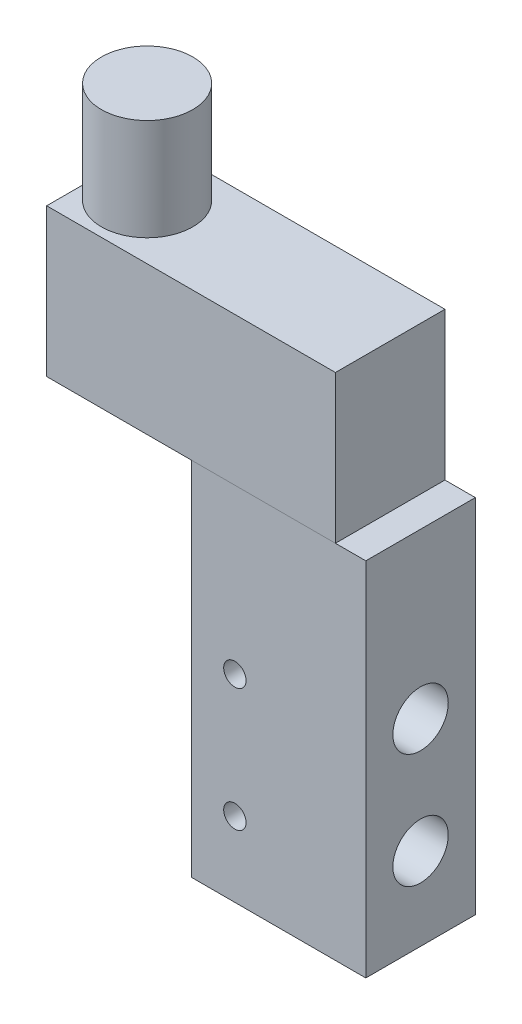
ISO-10303-21;
HEADER;
FILE_DESCRIPTION(('STEP AP214'),'2;1');
FILE_NAME('part.step','',(''),(''),'','','');
FILE_SCHEMA(('AUTOMOTIVE_DESIGN { 1 0 10303 214 1 1 1 1 }'));
ENDSEC;
DATA;
#1=APPLICATION_CONTEXT('core data for automotive mechanical design processes');
#2=APPLICATION_PROTOCOL_DEFINITION('international standard','automotive_design',2000,#1);
#3=PRODUCT_CONTEXT('',#1,'mechanical');
#4=PRODUCT('Part','Part','',(#3));
#5=PRODUCT_RELATED_PRODUCT_CATEGORY('part','',(#4));
#6=PRODUCT_DEFINITION_FORMATION('','',#4);
#7=PRODUCT_DEFINITION_CONTEXT('part definition',#1,'design');
#8=PRODUCT_DEFINITION('design','',#6,#7);
#9=PRODUCT_DEFINITION_SHAPE('','',#8);
#10=(LENGTH_UNIT() NAMED_UNIT(*) SI_UNIT(.MILLI.,.METRE.));
#11=(NAMED_UNIT(*) PLANE_ANGLE_UNIT() SI_UNIT($,.RADIAN.));
#12=(NAMED_UNIT(*) SI_UNIT($,.STERADIAN.) SOLID_ANGLE_UNIT());
#13=UNCERTAINTY_MEASURE_WITH_UNIT(LENGTH_MEASURE(1.E-05),#10,'distance_accuracy_value','');
#14=(GEOMETRIC_REPRESENTATION_CONTEXT(3) GLOBAL_UNCERTAINTY_ASSIGNED_CONTEXT((#13)) GLOBAL_UNIT_ASSIGNED_CONTEXT((#10,
#11,#12)) REPRESENTATION_CONTEXT('',''));
#15=CARTESIAN_POINT('',(0.,0.,0.));
#16=DIRECTION('',(0.,0.,1.));
#17=DIRECTION('',(1.,0.,0.));
#18=AXIS2_PLACEMENT_3D('',#15,#16,#17);
#19=CARTESIAN_POINT('',(0.,0.,0.));
#20=DIRECTION('',(0.,0.,1.));
#21=DIRECTION('',(1.,0.,0.));
#22=AXIS2_PLACEMENT_3D('',#19,#20,#21);
#23=PLANE('',#22);
#24=CARTESIAN_POINT('',(-8.8,-21.285,0.));
#25=DIRECTION('',(0.,0.,1.));
#26=DIRECTION('',(1.,0.,0.));
#27=AXIS2_PLACEMENT_3D('',#24,#25,#26);
#28=CIRCLE('',#27,2.24999999999999);
#29=CARTESIAN_POINT('',(-6.55,-21.285,0.));
#30=VERTEX_POINT('',#29);
#31=EDGE_CURVE('E153',#30,#30,#28,.T.);
#32=ORIENTED_EDGE('',*,*,#31,.T.);
#33=EDGE_LOOP('',(#32));
#34=FACE_BOUND('',#33,.T.);
#35=CARTESIAN_POINT('',(-8.8,3.41499999999999,0.));
#36=DIRECTION('',(0.,0.,1.));
#37=DIRECTION('',(1.,0.,0.));
#38=AXIS2_PLACEMENT_3D('',#35,#36,#37);
#39=CIRCLE('',#38,2.24999999999999);
#40=CARTESIAN_POINT('',(-6.55000000000001,3.41499999999999,0.));
#41=VERTEX_POINT('',#40);
#42=EDGE_CURVE('E147',#41,#41,#39,.T.);
#43=ORIENTED_EDGE('',*,*,#42,.T.);
#44=EDGE_LOOP('',(#43));
#45=FACE_BOUND('',#44,.T.);
#46=DIRECTION('',(-1.,0.,0.));
#47=VECTOR('',#46,1.);
#48=CARTESIAN_POINT('',(0.,36.285,0.));
#49=LINE('',#48,#47);
#50=CARTESIAN_POINT('',(11.4,36.285,0.));
#51=VERTEX_POINT('',#50);
#52=CARTESIAN_POINT('',(-17.5,36.285,0.));
#53=VERTEX_POINT('',#52);
#54=EDGE_CURVE('E11',#51,#53,#49,.T.);
#55=ORIENTED_EDGE('',*,*,#54,.F.);
#56=DIRECTION('',(-1.,0.,0.));
#57=VECTOR('',#56,1.);
#58=CARTESIAN_POINT('',(-17.5,36.285,0.));
#59=LINE('',#58,#57);
#60=CARTESIAN_POINT('',(17.5,36.285,0.));
#61=VERTEX_POINT('',#60);
#62=EDGE_CURVE('E206',#61,#51,#59,.T.);
#63=ORIENTED_EDGE('',*,*,#62,.F.);
#64=DIRECTION('',(0.,1.,0.));
#65=VECTOR('',#64,1.);
#66=CARTESIAN_POINT('',(17.5,36.285,0.));
#67=LINE('',#66,#65);
#68=CARTESIAN_POINT('',(17.5,-36.285,0.));
#69=VERTEX_POINT('',#68);
#70=EDGE_CURVE('E192',#69,#61,#67,.T.);
#71=ORIENTED_EDGE('',*,*,#70,.F.);
#72=DIRECTION('',(1.,0.,0.));
#73=VECTOR('',#72,1.);
#74=CARTESIAN_POINT('',(-17.5,-36.285,0.));
#75=LINE('',#74,#73);
#76=CARTESIAN_POINT('',(-17.5,-36.285,0.));
#77=VERTEX_POINT('',#76);
#78=EDGE_CURVE('E196',#77,#69,#75,.T.);
#79=ORIENTED_EDGE('',*,*,#78,.F.);
#80=DIRECTION('',(0.,-1.,0.));
#81=VECTOR('',#80,1.);
#82=CARTESIAN_POINT('',(-17.5,36.285,0.));
#83=LINE('',#82,#81);
#84=EDGE_CURVE('E209',#53,#77,#83,.T.);
#85=ORIENTED_EDGE('',*,*,#84,.F.);
#86=EDGE_LOOP('',(#55,#63,#71,#79,#85));
#87=FACE_BOUND('',#86,.T.);
#88=ADVANCED_FACE('F39',(#34,#45,#87),#23,.F.);
#89=CARTESIAN_POINT('',(0.,0.,22.));
#90=DIRECTION('',(0.,0.,1.));
#91=DIRECTION('',(1.,0.,0.));
#92=AXIS2_PLACEMENT_3D('',#89,#90,#91);
#93=PLANE('',#92);
#94=CARTESIAN_POINT('',(-8.8,3.41499999999999,22.));
#95=DIRECTION('',(0.,0.,1.));
#96=DIRECTION('',(1.,0.,0.));
#97=AXIS2_PLACEMENT_3D('',#94,#95,#96);
#98=CIRCLE('',#97,2.25);
#99=CARTESIAN_POINT('',(-6.55000000000001,3.41499999999999,22.));
#100=VERTEX_POINT('',#99);
#101=EDGE_CURVE('E144',#100,#100,#98,.T.);
#102=ORIENTED_EDGE('',*,*,#101,.F.);
#103=EDGE_LOOP('',(#102));
#104=FACE_BOUND('',#103,.T.);
#105=CARTESIAN_POINT('',(-8.8,-21.285,22.));
#106=DIRECTION('',(0.,0.,1.));
#107=DIRECTION('',(1.,0.,0.));
#108=AXIS2_PLACEMENT_3D('',#105,#106,#107);
#109=CIRCLE('',#108,2.25);
#110=CARTESIAN_POINT('',(-6.55,-21.285,22.));
#111=VERTEX_POINT('',#110);
#112=EDGE_CURVE('E150',#111,#111,#109,.T.);
#113=ORIENTED_EDGE('',*,*,#112,.F.);
#114=EDGE_LOOP('',(#113));
#115=FACE_BOUND('',#114,.T.);
#116=DIRECTION('',(-1.,0.,0.));
#117=VECTOR('',#116,1.);
#118=CARTESIAN_POINT('',(-17.5,36.285,22.));
#119=LINE('',#118,#117);
#120=CARTESIAN_POINT('',(11.8935960361455,36.285,22.));
#121=VERTEX_POINT('',#120);
#122=CARTESIAN_POINT('',(11.4,36.285,22.));
#123=VERTEX_POINT('',#122);
#124=EDGE_CURVE('E55',#121,#123,#119,.T.);
#125=ORIENTED_EDGE('',*,*,#124,.T.);
#126=DIRECTION('',(-1.,0.,0.));
#127=VECTOR('',#126,1.);
#128=CARTESIAN_POINT('',(0.,36.285,22.));
#129=LINE('',#128,#127);
#130=CARTESIAN_POINT('',(-17.5,36.285,22.));
#131=VERTEX_POINT('',#130);
#132=EDGE_CURVE('E48',#123,#131,#129,.T.);
#133=ORIENTED_EDGE('',*,*,#132,.T.);
#134=DIRECTION('',(0.,-1.,0.));
#135=VECTOR('',#134,1.);
#136=CARTESIAN_POINT('',(-17.5,36.285,22.));
#137=LINE('',#136,#135);
#138=CARTESIAN_POINT('',(-17.5,-36.285,22.));
#139=VERTEX_POINT('',#138);
#140=EDGE_CURVE('E199',#131,#139,#137,.T.);
#141=ORIENTED_EDGE('',*,*,#140,.T.);
#142=DIRECTION('',(1.,0.,0.));
#143=VECTOR('',#142,1.);
#144=CARTESIAN_POINT('',(-17.5,-36.285,22.));
#145=LINE('',#144,#143);
#146=CARTESIAN_POINT('',(17.5,-36.285,22.));
#147=VERTEX_POINT('',#146);
#148=EDGE_CURVE('E201',#139,#147,#145,.T.);
#149=ORIENTED_EDGE('',*,*,#148,.T.);
#150=DIRECTION('',(0.,1.,0.));
#151=VECTOR('',#150,1.);
#152=CARTESIAN_POINT('',(17.5,36.285,22.));
#153=LINE('',#152,#151);
#154=CARTESIAN_POINT('',(17.5,36.285,22.));
#155=VERTEX_POINT('',#154);
#156=EDGE_CURVE('E193',#147,#155,#153,.T.);
#157=ORIENTED_EDGE('',*,*,#156,.T.);
#158=EDGE_CURVE('E197',#155,#121,#119,.T.);
#159=ORIENTED_EDGE('',*,*,#158,.T.);
#160=EDGE_LOOP('',(#125,#133,#141,#149,#157,#159));
#161=FACE_BOUND('',#160,.T.);
#162=ADVANCED_FACE('F228',(#104,#115,#161),#93,.T.);
#163=CARTESIAN_POINT('',(-17.5,36.285,22.));
#164=DIRECTION('',(0.,-1.,0.));
#165=DIRECTION('',(0.,0.,-1.));
#166=AXIS2_PLACEMENT_3D('',#163,#164,#165);
#167=PLANE('',#166);
#168=DIRECTION('',(0.,0.,-1.));
#169=VECTOR('',#168,1.);
#170=CARTESIAN_POINT('',(11.4,36.285,0.));
#171=LINE('',#170,#169);
#172=EDGE_CURVE('E172',#123,#51,#171,.T.);
#173=ORIENTED_EDGE('',*,*,#172,.F.);
#174=ORIENTED_EDGE('',*,*,#124,.F.);
#175=ORIENTED_EDGE('',*,*,#158,.F.);
#176=DIRECTION('',(0.,0.,-1.));
#177=VECTOR('',#176,1.);
#178=CARTESIAN_POINT('',(17.5,36.285,22.));
#179=LINE('',#178,#177);
#180=EDGE_CURVE('E220',#155,#61,#179,.T.);
#181=ORIENTED_EDGE('',*,*,#180,.T.);
#182=ORIENTED_EDGE('',*,*,#62,.T.);
#183=EDGE_LOOP('',(#173,#174,#175,#181,#182));
#184=FACE_BOUND('',#183,.T.);
#185=ADVANCED_FACE('F256',(#184),#167,.F.);
#186=CARTESIAN_POINT('',(17.5,36.285,22.));
#187=DIRECTION('',(-1.,0.,0.));
#188=DIRECTION('',(0.,-1.,0.));
#189=AXIS2_PLACEMENT_3D('',#186,#187,#188);
#190=PLANE('',#189);
#191=CARTESIAN_POINT('',(17.5,3.31499999999999,11.));
#192=DIRECTION('',(1.,0.,0.));
#193=DIRECTION('',(0.,0.,-1.));
#194=AXIS2_PLACEMENT_3D('',#191,#192,#193);
#195=CIRCLE('',#194,5.56259999999999);
#196=CARTESIAN_POINT('',(17.5,3.31499999999999,5.43740000000001));
#197=VERTEX_POINT('',#196);
#198=EDGE_CURVE('E128',#197,#197,#195,.T.);
#199=ORIENTED_EDGE('',*,*,#198,.F.);
#200=EDGE_LOOP('',(#199));
#201=FACE_BOUND('',#200,.T.);
#202=CARTESIAN_POINT('',(17.5,-19.685,11.));
#203=DIRECTION('',(1.,0.,0.));
#204=DIRECTION('',(0.,0.,-1.));
#205=AXIS2_PLACEMENT_3D('',#202,#203,#204);
#206=CIRCLE('',#205,5.56259999999999);
#207=CARTESIAN_POINT('',(17.5,-19.685,5.43740000000001));
#208=VERTEX_POINT('',#207);
#209=EDGE_CURVE('E127',#208,#208,#206,.T.);
#210=ORIENTED_EDGE('',*,*,#209,.F.);
#211=EDGE_LOOP('',(#210));
#212=FACE_BOUND('',#211,.T.);
#213=ORIENTED_EDGE('',*,*,#70,.T.);
#214=ORIENTED_EDGE('',*,*,#180,.F.);
#215=ORIENTED_EDGE('',*,*,#156,.F.);
#216=DIRECTION('',(0.,0.,-1.));
#217=VECTOR('',#216,1.);
#218=CARTESIAN_POINT('',(17.5,-36.285,22.));
#219=LINE('',#218,#217);
#220=EDGE_CURVE('E203',#147,#69,#219,.T.);
#221=ORIENTED_EDGE('',*,*,#220,.T.);
#222=EDGE_LOOP('',(#213,#214,#215,#221));
#223=FACE_BOUND('',#222,.T.);
#224=ADVANCED_FACE('F41',(#201,#212,#223),#190,.F.);
#225=CARTESIAN_POINT('',(-17.5,36.285,22.));
#226=DIRECTION('',(1.,0.,0.));
#227=DIRECTION('',(0.,1.,0.));
#228=AXIS2_PLACEMENT_3D('',#225,#226,#227);
#229=PLANE('',#228);
#230=CARTESIAN_POINT('',(-17.5,-7.98500000000001,11.));
#231=DIRECTION('',(-1.,0.,0.));
#232=DIRECTION('',(0.,0.,1.));
#233=AXIS2_PLACEMENT_3D('',#230,#231,#232);
#234=CIRCLE('',#233,5.56259999999999);
#235=CARTESIAN_POINT('',(-17.5,-7.98500000000001,16.5626));
#236=VERTEX_POINT('',#235);
#237=EDGE_CURVE('E138',#236,#236,#234,.T.);
#238=ORIENTED_EDGE('',*,*,#237,.F.);
#239=EDGE_LOOP('',(#238));
#240=FACE_BOUND('',#239,.T.);
#241=ORIENTED_EDGE('',*,*,#84,.T.);
#242=DIRECTION('',(0.,0.,-1.));
#243=VECTOR('',#242,1.);
#244=CARTESIAN_POINT('',(-17.5,-36.285,22.));
#245=LINE('',#244,#243);
#246=EDGE_CURVE('E214',#139,#77,#245,.T.);
#247=ORIENTED_EDGE('',*,*,#246,.F.);
#248=ORIENTED_EDGE('',*,*,#140,.F.);
#249=DIRECTION('',(0.,0.,-1.));
#250=VECTOR('',#249,1.);
#251=CARTESIAN_POINT('',(-17.5,36.285,22.));
#252=LINE('',#251,#250);
#253=EDGE_CURVE('E217',#131,#53,#252,.T.);
#254=ORIENTED_EDGE('',*,*,#253,.T.);
#255=EDGE_LOOP('',(#241,#247,#248,#254));
#256=FACE_BOUND('',#255,.T.);
#257=ADVANCED_FACE('F234',(#240,#256),#229,.F.);
#258=CARTESIAN_POINT('',(-17.5,-36.285,22.));
#259=DIRECTION('',(0.,1.,0.));
#260=DIRECTION('',(0.,0.,1.));
#261=AXIS2_PLACEMENT_3D('',#258,#259,#260);
#262=PLANE('',#261);
#263=ORIENTED_EDGE('',*,*,#78,.T.);
#264=ORIENTED_EDGE('',*,*,#220,.F.);
#265=ORIENTED_EDGE('',*,*,#148,.F.);
#266=ORIENTED_EDGE('',*,*,#246,.T.);
#267=EDGE_LOOP('',(#263,#264,#265,#266));
#268=FACE_BOUND('',#267,.T.);
#269=ADVANCED_FACE('F262',(#268),#262,.F.);
#270=ORIENTED_EDGE('',*,*,#132,.F.);
#271=DIRECTION('',(0.,-1.,0.));
#272=VECTOR('',#271,1.);
#273=CARTESIAN_POINT('',(11.4,65.995,22.));
#274=LINE('',#273,#272);
#275=CARTESIAN_POINT('',(11.4,65.995,22.));
#276=VERTEX_POINT('',#275);
#277=EDGE_CURVE('E171',#276,#123,#274,.T.);
#278=ORIENTED_EDGE('',*,*,#277,.F.);
#279=DIRECTION('',(1.,0.,0.));
#280=VECTOR('',#279,1.);
#281=CARTESIAN_POINT('',(11.4,65.995,22.));
#282=LINE('',#281,#280);
#283=CARTESIAN_POINT('',(-46.6,65.995,22.));
#284=VERTEX_POINT('',#283);
#285=EDGE_CURVE('E169',#284,#276,#282,.T.);
#286=ORIENTED_EDGE('',*,*,#285,.F.);
#287=DIRECTION('',(0.,-1.,0.));
#288=VECTOR('',#287,1.);
#289=CARTESIAN_POINT('',(-46.6,65.995,22.));
#290=LINE('',#289,#288);
#291=CARTESIAN_POINT('',(-46.6,36.285,22.));
#292=VERTEX_POINT('',#291);
#293=EDGE_CURVE('E183',#284,#292,#290,.T.);
#294=ORIENTED_EDGE('',*,*,#293,.T.);
#295=DIRECTION('',(1.,0.,0.));
#296=VECTOR('',#295,1.);
#297=CARTESIAN_POINT('',(11.4,36.285,22.));
#298=LINE('',#297,#296);
#299=EDGE_CURVE('E163',#292,#131,#298,.T.);
#300=ORIENTED_EDGE('',*,*,#299,.T.);
#301=EDGE_LOOP('',(#270,#278,#286,#294,#300));
#302=FACE_BOUND('',#301,.T.);
#303=ADVANCED_FACE('F242',(#302),#93,.T.);
#304=DIRECTION('',(0.,-1.,0.));
#305=VECTOR('',#304,1.);
#306=CARTESIAN_POINT('',(11.4,65.995,0.));
#307=LINE('',#306,#305);
#308=CARTESIAN_POINT('',(11.4,65.995,0.));
#309=VERTEX_POINT('',#308);
#310=EDGE_CURVE('E189',#309,#51,#307,.T.);
#311=ORIENTED_EDGE('',*,*,#310,.T.);
#312=ORIENTED_EDGE('',*,*,#54,.T.);
#313=DIRECTION('',(-1.,0.,0.));
#314=VECTOR('',#313,1.);
#315=CARTESIAN_POINT('',(11.4,36.285,0.));
#316=LINE('',#315,#314);
#317=CARTESIAN_POINT('',(-46.6,36.285,0.));
#318=VERTEX_POINT('',#317);
#319=EDGE_CURVE('E175',#53,#318,#316,.T.);
#320=ORIENTED_EDGE('',*,*,#319,.T.);
#321=DIRECTION('',(0.,-1.,0.));
#322=VECTOR('',#321,1.);
#323=CARTESIAN_POINT('',(-46.6,65.995,0.));
#324=LINE('',#323,#322);
#325=CARTESIAN_POINT('',(-46.6,65.995,0.));
#326=VERTEX_POINT('',#325);
#327=EDGE_CURVE('E186',#326,#318,#324,.T.);
#328=ORIENTED_EDGE('',*,*,#327,.F.);
#329=DIRECTION('',(-1.,0.,0.));
#330=VECTOR('',#329,1.);
#331=CARTESIAN_POINT('',(11.4,65.995,0.));
#332=LINE('',#331,#330);
#333=EDGE_CURVE('E162',#309,#326,#332,.T.);
#334=ORIENTED_EDGE('',*,*,#333,.F.);
#335=EDGE_LOOP('',(#311,#312,#320,#328,#334));
#336=FACE_BOUND('',#335,.T.);
#337=ADVANCED_FACE('F251',(#336),#23,.F.);
#338=CARTESIAN_POINT('',(0.,36.285,0.));
#339=DIRECTION('',(0.,-1.,0.));
#340=DIRECTION('',(0.,0.,-1.));
#341=AXIS2_PLACEMENT_3D('',#338,#339,#340);
#342=PLANE('',#341);
#343=ORIENTED_EDGE('',*,*,#299,.F.);
#344=DIRECTION('',(0.,0.,1.));
#345=VECTOR('',#344,1.);
#346=CARTESIAN_POINT('',(-46.6,36.285,0.));
#347=LINE('',#346,#345);
#348=EDGE_CURVE('E177',#318,#292,#347,.T.);
#349=ORIENTED_EDGE('',*,*,#348,.F.);
#350=ORIENTED_EDGE('',*,*,#319,.F.);
#351=ORIENTED_EDGE('',*,*,#253,.F.);
#352=EDGE_LOOP('',(#343,#349,#350,#351));
#353=FACE_BOUND('',#352,.T.);
#354=ADVANCED_FACE('F240',(#353),#342,.T.);
#355=CARTESIAN_POINT('',(11.4,65.995,0.));
#356=DIRECTION('',(-1.,0.,0.));
#357=DIRECTION('',(0.,0.,1.));
#358=AXIS2_PLACEMENT_3D('',#355,#356,#357);
#359=PLANE('',#358);
#360=ORIENTED_EDGE('',*,*,#172,.T.);
#361=ORIENTED_EDGE('',*,*,#310,.F.);
#362=DIRECTION('',(0.,0.,-1.));
#363=VECTOR('',#362,1.);
#364=CARTESIAN_POINT('',(11.4,65.995,0.));
#365=LINE('',#364,#363);
#366=EDGE_CURVE('E159',#276,#309,#365,.T.);
#367=ORIENTED_EDGE('',*,*,#366,.F.);
#368=ORIENTED_EDGE('',*,*,#277,.T.);
#369=EDGE_LOOP('',(#360,#361,#367,#368));
#370=FACE_BOUND('',#369,.T.);
#371=ADVANCED_FACE('F284',(#370),#359,.F.);
#372=CARTESIAN_POINT('',(-46.6,65.995,0.));
#373=DIRECTION('',(1.,0.,0.));
#374=DIRECTION('',(0.,0.,-1.));
#375=AXIS2_PLACEMENT_3D('',#372,#373,#374);
#376=PLANE('',#375);
#377=DIRECTION('',(0.,0.,1.));
#378=VECTOR('',#377,1.);
#379=CARTESIAN_POINT('',(-46.6,65.995,0.));
#380=LINE('',#379,#378);
#381=CARTESIAN_POINT('',(-46.6,65.995,11.));
#382=VERTEX_POINT('',#381);
#383=EDGE_CURVE('E165',#382,#284,#380,.T.);
#384=ORIENTED_EDGE('',*,*,#383,.F.);
#385=EDGE_CURVE('E166',#326,#382,#380,.T.);
#386=ORIENTED_EDGE('',*,*,#385,.F.);
#387=ORIENTED_EDGE('',*,*,#327,.T.);
#388=ORIENTED_EDGE('',*,*,#348,.T.);
#389=ORIENTED_EDGE('',*,*,#293,.F.);
#390=EDGE_LOOP('',(#384,#386,#387,#388,#389));
#391=FACE_BOUND('',#390,.T.);
#392=ADVANCED_FACE('F247',(#391),#376,.F.);
#393=CARTESIAN_POINT('',(0.,65.995,0.));
#394=DIRECTION('',(0.,-1.,0.));
#395=DIRECTION('',(0.,0.,-1.));
#396=AXIS2_PLACEMENT_3D('',#393,#394,#395);
#397=PLANE('',#396);
#398=ORIENTED_EDGE('',*,*,#385,.T.);
#399=CARTESIAN_POINT('',(-37.425,65.995,11.));
#400=DIRECTION('',(0.,-1.,0.));
#401=DIRECTION('',(0.,0.,-1.));
#402=AXIS2_PLACEMENT_3D('',#399,#400,#401);
#403=CIRCLE('',#402,9.175);
#404=EDGE_CURVE('E61',#382,#382,#403,.T.);
#405=ORIENTED_EDGE('',*,*,#404,.T.);
#406=ORIENTED_EDGE('',*,*,#383,.T.);
#407=ORIENTED_EDGE('',*,*,#285,.T.);
#408=ORIENTED_EDGE('',*,*,#366,.T.);
#409=ORIENTED_EDGE('',*,*,#333,.T.);
#410=EDGE_LOOP('',(#398,#405,#406,#407,#408,#409));
#411=FACE_BOUND('',#410,.T.);
#412=ADVANCED_FACE('F293',(#411),#397,.F.);
#413=CARTESIAN_POINT('',(-37.425,86.395,11.));
#414=DIRECTION('',(0.,-1.,0.));
#415=DIRECTION('',(0.,0.,-1.));
#416=AXIS2_PLACEMENT_3D('',#413,#414,#415);
#417=CYLINDRICAL_SURFACE('',#416,9.175);
#418=CARTESIAN_POINT('',(-37.425,86.395,11.));
#419=DIRECTION('',(0.,-1.,0.));
#420=DIRECTION('',(0.,0.,-1.));
#421=AXIS2_PLACEMENT_3D('',#418,#419,#420);
#422=CIRCLE('',#421,9.175);
#423=CARTESIAN_POINT('',(-37.425,86.395,1.825));
#424=VERTEX_POINT('',#423);
#425=EDGE_CURVE('E156',#424,#424,#422,.T.);
#426=ORIENTED_EDGE('',*,*,#425,.T.);
#427=EDGE_LOOP('',(#426));
#428=FACE_BOUND('',#427,.T.);
#429=ORIENTED_EDGE('',*,*,#404,.F.);
#430=EDGE_LOOP('',(#429));
#431=FACE_BOUND('',#430,.T.);
#432=ADVANCED_FACE('F299',(#428,#431),#417,.T.);
#433=CARTESIAN_POINT('',(-37.425,86.395,11.));
#434=DIRECTION('',(0.,-1.,0.));
#435=DIRECTION('',(0.,0.,-1.));
#436=AXIS2_PLACEMENT_3D('',#433,#434,#435);
#437=PLANE('',#436);
#438=ORIENTED_EDGE('',*,*,#425,.F.);
#439=EDGE_LOOP('',(#438));
#440=FACE_BOUND('',#439,.T.);
#441=ADVANCED_FACE('F304',(#440),#437,.F.);
#442=CARTESIAN_POINT('',(-8.8,-21.285,22.));
#443=DIRECTION('',(0.,0.,1.));
#444=DIRECTION('',(1.,0.,0.));
#445=AXIS2_PLACEMENT_3D('',#442,#443,#444);
#446=CYLINDRICAL_SURFACE('',#445,2.25);
#447=ORIENTED_EDGE('',*,*,#31,.F.);
#448=EDGE_LOOP('',(#447));
#449=FACE_BOUND('',#448,.T.);
#450=ORIENTED_EDGE('',*,*,#112,.T.);
#451=EDGE_LOOP('',(#450));
#452=FACE_BOUND('',#451,.T.);
#453=ADVANCED_FACE('F310',(#449,#452),#446,.F.);
#454=CARTESIAN_POINT('',(-8.8,3.41499999999999,22.));
#455=DIRECTION('',(0.,0.,1.));
#456=DIRECTION('',(1.,0.,0.));
#457=AXIS2_PLACEMENT_3D('',#454,#455,#456);
#458=CYLINDRICAL_SURFACE('',#457,2.25);
#459=ORIENTED_EDGE('',*,*,#42,.F.);
#460=EDGE_LOOP('',(#459));
#461=FACE_BOUND('',#460,.T.);
#462=ORIENTED_EDGE('',*,*,#101,.T.);
#463=EDGE_LOOP('',(#462));
#464=FACE_BOUND('',#463,.T.);
#465=ADVANCED_FACE('F316',(#461,#464),#458,.F.);
#466=CARTESIAN_POINT('',(-2.5,-7.98500000000001,11.));
#467=DIRECTION('',(-1.,0.,0.));
#468=DIRECTION('',(0.,0.,1.));
#469=AXIS2_PLACEMENT_3D('',#466,#467,#468);
#470=CONICAL_SURFACE('',#469,5.56259999999999,1.02974425867665);
#471=CARTESIAN_POINT('',(0.842347279402706,-7.98500000000002,11.));
#472=VERTEX_POINT('',#471);
#473=VERTEX_LOOP('',#472);
#474=FACE_BOUND('',#473,.T.);
#475=CARTESIAN_POINT('',(-2.5,-7.98500000000001,11.));
#476=DIRECTION('',(-1.,0.,0.));
#477=DIRECTION('',(0.,0.,1.));
#478=AXIS2_PLACEMENT_3D('',#475,#476,#477);
#479=CIRCLE('',#478,5.56259999999999);
#480=CARTESIAN_POINT('',(-2.5,-7.98500000000001,16.5626));
#481=VERTEX_POINT('',#480);
#482=EDGE_CURVE('E141',#481,#481,#479,.T.);
#483=ORIENTED_EDGE('',*,*,#482,.T.);
#484=EDGE_LOOP('',(#483));
#485=FACE_BOUND('',#484,.T.);
#486=ADVANCED_FACE('F320',(#474,#485),#470,.F.);
#487=CARTESIAN_POINT('',(-17.5,-7.98500000000001,11.));
#488=DIRECTION('',(-1.,0.,0.));
#489=DIRECTION('',(0.,0.,1.));
#490=AXIS2_PLACEMENT_3D('',#487,#488,#489);
#491=CYLINDRICAL_SURFACE('',#490,5.56259999999999);
#492=ORIENTED_EDGE('',*,*,#482,.F.);
#493=EDGE_LOOP('',(#492));
#494=FACE_BOUND('',#493,.T.);
#495=ORIENTED_EDGE('',*,*,#237,.T.);
#496=EDGE_LOOP('',(#495));
#497=FACE_BOUND('',#496,.T.);
#498=ADVANCED_FACE('F324',(#494,#497),#491,.F.);
#499=CARTESIAN_POINT('',(2.50000000000001,-19.685,11.));
#500=DIRECTION('',(1.,0.,0.));
#501=DIRECTION('',(0.,0.,-1.));
#502=AXIS2_PLACEMENT_3D('',#499,#500,#501);
#503=CONICAL_SURFACE('',#502,5.56259999999999,1.02974425867665);
#504=CARTESIAN_POINT('',(-0.842347279402696,-19.685,11.));
#505=VERTEX_POINT('',#504);
#506=VERTEX_LOOP('',#505);
#507=FACE_BOUND('',#506,.T.);
#508=CARTESIAN_POINT('',(2.50000000000001,-19.685,11.));
#509=DIRECTION('',(1.,0.,0.));
#510=DIRECTION('',(0.,0.,-1.));
#511=AXIS2_PLACEMENT_3D('',#508,#509,#510);
#512=CIRCLE('',#511,5.56259999999999);
#513=CARTESIAN_POINT('',(2.50000000000001,-19.685,5.43740000000001));
#514=VERTEX_POINT('',#513);
#515=EDGE_CURVE('E131',#514,#514,#512,.T.);
#516=ORIENTED_EDGE('',*,*,#515,.T.);
#517=EDGE_LOOP('',(#516));
#518=FACE_BOUND('',#517,.T.);
#519=ADVANCED_FACE('F328',(#507,#518),#503,.F.);
#520=CARTESIAN_POINT('',(17.5,-19.685,11.));
#521=DIRECTION('',(1.,0.,0.));
#522=DIRECTION('',(0.,0.,-1.));
#523=AXIS2_PLACEMENT_3D('',#520,#521,#522);
#524=CYLINDRICAL_SURFACE('',#523,5.56259999999999);
#525=ORIENTED_EDGE('',*,*,#515,.F.);
#526=EDGE_LOOP('',(#525));
#527=FACE_BOUND('',#526,.T.);
#528=ORIENTED_EDGE('',*,*,#209,.T.);
#529=EDGE_LOOP('',(#528));
#530=FACE_BOUND('',#529,.T.);
#531=ADVANCED_FACE('F121',(#527,#530),#524,.F.);
#532=CARTESIAN_POINT('',(2.50000000000001,3.31499999999999,11.));
#533=DIRECTION('',(1.,0.,0.));
#534=DIRECTION('',(0.,0.,-1.));
#535=AXIS2_PLACEMENT_3D('',#532,#533,#534);
#536=CONICAL_SURFACE('',#535,5.56259999999999,1.02974425867665);
#537=CARTESIAN_POINT('',(-0.842347279402699,3.31499999999999,11.));
#538=VERTEX_POINT('',#537);
#539=VERTEX_LOOP('',#538);
#540=FACE_BOUND('',#539,.T.);
#541=CARTESIAN_POINT('',(2.50000000000001,3.31499999999999,11.));
#542=DIRECTION('',(1.,0.,0.));
#543=DIRECTION('',(0.,0.,-1.));
#544=AXIS2_PLACEMENT_3D('',#541,#542,#543);
#545=CIRCLE('',#544,5.56259999999999);
#546=CARTESIAN_POINT('',(2.50000000000001,3.31499999999999,5.43740000000001));
#547=VERTEX_POINT('',#546);
#548=EDGE_CURVE('E125',#547,#547,#545,.T.);
#549=ORIENTED_EDGE('',*,*,#548,.T.);
#550=EDGE_LOOP('',(#549));
#551=FACE_BOUND('',#550,.T.);
#552=ADVANCED_FACE('F117',(#540,#551),#536,.F.);
#553=CARTESIAN_POINT('',(17.5,3.31499999999999,11.));
#554=DIRECTION('',(1.,0.,0.));
#555=DIRECTION('',(0.,0.,-1.));
#556=AXIS2_PLACEMENT_3D('',#553,#554,#555);
#557=CYLINDRICAL_SURFACE('',#556,5.56259999999999);
#558=ORIENTED_EDGE('',*,*,#548,.F.);
#559=EDGE_LOOP('',(#558));
#560=FACE_BOUND('',#559,.T.);
#561=ORIENTED_EDGE('',*,*,#198,.T.);
#562=EDGE_LOOP('',(#561));
#563=FACE_BOUND('',#562,.T.);
#564=ADVANCED_FACE('F120',(#560,#563),#557,.F.);
#565=CLOSED_SHELL('',(#88,#162,#185,#224,#257,#269,#303,#337,#354,#371,#392,#412,#432,#441,#453,
#465,#486,#498,#519,#531,#552,#564));
#566=MANIFOLD_SOLID_BREP('B2',#565);
#567=ADVANCED_BREP_SHAPE_REPRESENTATION('',(#18,#566),#14);
#568=SHAPE_DEFINITION_REPRESENTATION(#9,#567);
ENDSEC;
END-ISO-10303-21;
